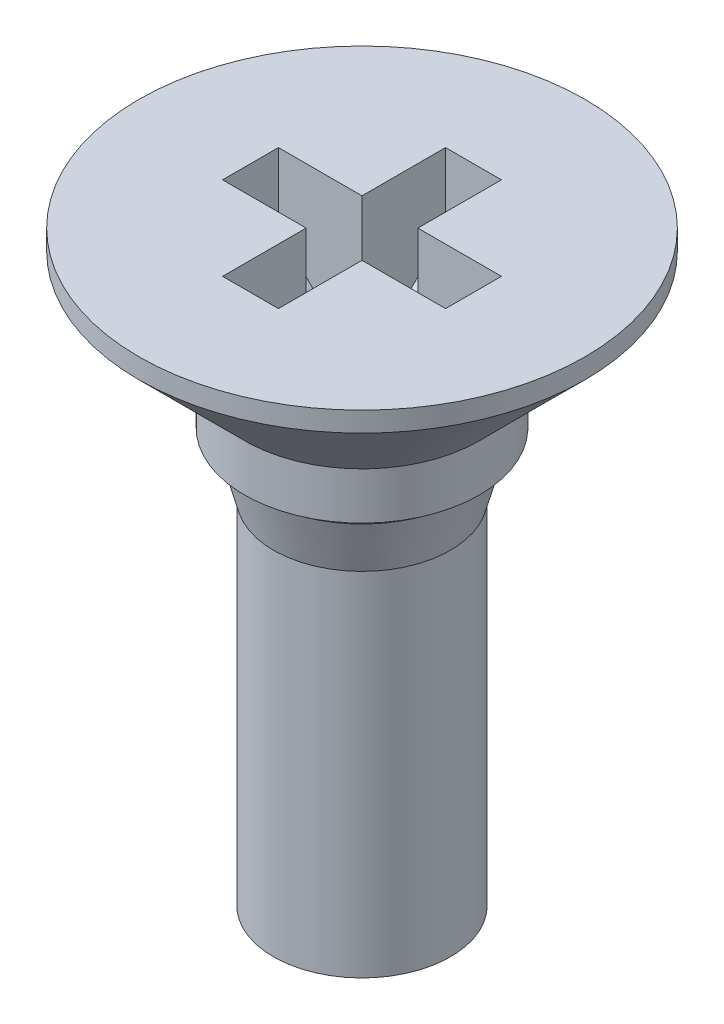
ISO-10303-21;
HEADER;
FILE_DESCRIPTION(('STEP AP214'),'2;1');
FILE_NAME('part.step','',(''),(''),'','','');
FILE_SCHEMA(('AUTOMOTIVE_DESIGN { 1 0 10303 214 1 1 1 1 }'));
ENDSEC;
DATA;
#1=APPLICATION_CONTEXT('core data for automotive mechanical design processes');
#2=APPLICATION_PROTOCOL_DEFINITION('international standard','automotive_design',2000,#1);
#3=PRODUCT_CONTEXT('',#1,'mechanical');
#4=PRODUCT('Part','Part','',(#3));
#5=PRODUCT_RELATED_PRODUCT_CATEGORY('part','',(#4));
#6=PRODUCT_DEFINITION_FORMATION('','',#4);
#7=PRODUCT_DEFINITION_CONTEXT('part definition',#1,'design');
#8=PRODUCT_DEFINITION('design','',#6,#7);
#9=PRODUCT_DEFINITION_SHAPE('','',#8);
#10=(LENGTH_UNIT() NAMED_UNIT(*) SI_UNIT(.MILLI.,.METRE.));
#11=(NAMED_UNIT(*) PLANE_ANGLE_UNIT() SI_UNIT($,.RADIAN.));
#12=(NAMED_UNIT(*) SI_UNIT($,.STERADIAN.) SOLID_ANGLE_UNIT());
#13=UNCERTAINTY_MEASURE_WITH_UNIT(LENGTH_MEASURE(1.E-05),#10,'distance_accuracy_value','');
#14=(GEOMETRIC_REPRESENTATION_CONTEXT(3) GLOBAL_UNCERTAINTY_ASSIGNED_CONTEXT((#13)) GLOBAL_UNIT_ASSIGNED_CONTEXT((#10,
#11,#12)) REPRESENTATION_CONTEXT('',''));
#15=CARTESIAN_POINT('',(0.,0.,0.));
#16=DIRECTION('',(0.,0.,1.));
#17=DIRECTION('',(1.,0.,0.));
#18=AXIS2_PLACEMENT_3D('',#15,#16,#17);
#19=CARTESIAN_POINT('',(0.,-1.55,-0.238));
#20=DIRECTION('',(0.,0.,-1.));
#21=DIRECTION('',(-1.,0.,0.));
#22=AXIS2_PLACEMENT_3D('',#19,#20,#21);
#23=PLANE('',#22);
#24=DIRECTION('',(0.,1.,0.));
#25=VECTOR('',#24,1.);
#26=CARTESIAN_POINT('',(0.238,-1.55,-0.238));
#27=LINE('',#26,#25);
#28=CARTESIAN_POINT('',(0.238,-1.2,-0.238));
#29=VERTEX_POINT('',#28);
#30=CARTESIAN_POINT('',(0.238,0.,-0.238));
#31=VERTEX_POINT('',#30);
#32=EDGE_CURVE('E199',#29,#31,#27,.T.);
#33=ORIENTED_EDGE('',*,*,#32,.F.);
#34=DIRECTION('',(1.,0.,0.));
#35=VECTOR('',#34,1.);
#36=CARTESIAN_POINT('',(-0.350000000000003,-1.2,-0.238));
#37=LINE('',#36,#35);
#38=CARTESIAN_POINT('',(0.350000000000003,-1.2,-0.238));
#39=VERTEX_POINT('',#38);
#40=EDGE_CURVE('E234',#29,#39,#37,.T.);
#41=ORIENTED_EDGE('',*,*,#40,.T.);
#42=DIRECTION('',(0.707106781186546,0.707106781186549,0.));
#43=VECTOR('',#42,1.);
#44=CARTESIAN_POINT('',(0.95,-0.6,-0.238));
#45=LINE('',#44,#43);
#46=CARTESIAN_POINT('',(0.95,-0.6,-0.238));
#47=VERTEX_POINT('',#46);
#48=EDGE_CURVE('E238',#39,#47,#45,.T.);
#49=ORIENTED_EDGE('',*,*,#48,.T.);
#50=DIRECTION('',(0.,1.,0.));
#51=VECTOR('',#50,1.);
#52=CARTESIAN_POINT('',(0.95,0.,-0.238));
#53=LINE('',#52,#51);
#54=CARTESIAN_POINT('',(0.95,0.,-0.238));
#55=VERTEX_POINT('',#54);
#56=EDGE_CURVE('E241',#47,#55,#53,.T.);
#57=ORIENTED_EDGE('',*,*,#56,.T.);
#58=DIRECTION('',(-1.,0.,0.));
#59=VECTOR('',#58,1.);
#60=CARTESIAN_POINT('',(0.95,0.,-0.238));
#61=LINE('',#60,#59);
#62=EDGE_CURVE('E245',#55,#31,#61,.T.);
#63=ORIENTED_EDGE('',*,*,#62,.T.);
#64=EDGE_LOOP('',(#33,#41,#49,#57,#63));
#65=FACE_BOUND('',#64,.T.);
#66=ADVANCED_FACE('F37',(#65),#23,.F.);
#67=CARTESIAN_POINT('',(0.,-1.55,0.238));
#68=DIRECTION('',(0.,0.,-1.));
#69=DIRECTION('',(-1.,0.,0.));
#70=AXIS2_PLACEMENT_3D('',#67,#68,#69);
#71=PLANE('',#70);
#72=DIRECTION('',(1.,0.,0.));
#73=VECTOR('',#72,1.);
#74=CARTESIAN_POINT('',(-0.350000000000003,-1.2,0.238));
#75=LINE('',#74,#73);
#76=CARTESIAN_POINT('',(0.238,-1.2,0.238));
#77=VERTEX_POINT('',#76);
#78=CARTESIAN_POINT('',(0.350000000000003,-1.2,0.238));
#79=VERTEX_POINT('',#78);
#80=EDGE_CURVE('E216',#77,#79,#75,.T.);
#81=ORIENTED_EDGE('',*,*,#80,.F.);
#82=DIRECTION('',(0.,1.,0.));
#83=VECTOR('',#82,1.);
#84=CARTESIAN_POINT('',(0.238,-1.55,0.238));
#85=LINE('',#84,#83);
#86=CARTESIAN_POINT('',(0.238,0.,0.238));
#87=VERTEX_POINT('',#86);
#88=EDGE_CURVE('E45',#77,#87,#85,.T.);
#89=ORIENTED_EDGE('',*,*,#88,.T.);
#90=DIRECTION('',(-1.,0.,0.));
#91=VECTOR('',#90,1.);
#92=CARTESIAN_POINT('',(0.95,0.,0.238));
#93=LINE('',#92,#91);
#94=CARTESIAN_POINT('',(0.95,0.,0.238));
#95=VERTEX_POINT('',#94);
#96=EDGE_CURVE('E225',#95,#87,#93,.T.);
#97=ORIENTED_EDGE('',*,*,#96,.F.);
#98=DIRECTION('',(0.,1.,0.));
#99=VECTOR('',#98,1.);
#100=CARTESIAN_POINT('',(0.95,0.,0.238));
#101=LINE('',#100,#99);
#102=CARTESIAN_POINT('',(0.95,-0.6,0.238));
#103=VERTEX_POINT('',#102);
#104=EDGE_CURVE('E222',#103,#95,#101,.T.);
#105=ORIENTED_EDGE('',*,*,#104,.F.);
#106=DIRECTION('',(0.707106781186546,0.707106781186549,0.));
#107=VECTOR('',#106,1.);
#108=CARTESIAN_POINT('',(0.95,-0.6,0.238));
#109=LINE('',#108,#107);
#110=EDGE_CURVE('E219',#79,#103,#109,.T.);
#111=ORIENTED_EDGE('',*,*,#110,.F.);
#112=EDGE_LOOP('',(#81,#89,#97,#105,#111));
#113=FACE_BOUND('',#112,.T.);
#114=ADVANCED_FACE('F291',(#113),#71,.T.);
#115=CARTESIAN_POINT('',(0.,0.,0.));
#116=DIRECTION('',(0.,-1.,0.));
#117=DIRECTION('',(1.,0.,0.));
#118=AXIS2_PLACEMENT_3D('',#115,#116,#117);
#119=PLANE('',#118);
#120=DIRECTION('',(1.,0.,0.));
#121=VECTOR('',#120,1.);
#122=CARTESIAN_POINT('',(-0.238,0.,0.95));
#123=LINE('',#122,#121);
#124=CARTESIAN_POINT('',(-0.238,0.,0.95));
#125=VERTEX_POINT('',#124);
#126=CARTESIAN_POINT('',(0.238,0.,0.95));
#127=VERTEX_POINT('',#126);
#128=EDGE_CURVE('E200',#125,#127,#123,.T.);
#129=ORIENTED_EDGE('',*,*,#128,.F.);
#130=DIRECTION('',(0.,0.,1.));
#131=VECTOR('',#130,1.);
#132=CARTESIAN_POINT('',(-0.238,0.,-0.95));
#133=LINE('',#132,#131);
#134=CARTESIAN_POINT('',(-0.238,0.,0.238));
#135=VERTEX_POINT('',#134);
#136=EDGE_CURVE('E193',#135,#125,#133,.T.);
#137=ORIENTED_EDGE('',*,*,#136,.F.);
#138=CARTESIAN_POINT('',(-0.95,0.,0.238));
#139=VERTEX_POINT('',#138);
#140=EDGE_CURVE('E224',#135,#139,#93,.T.);
#141=ORIENTED_EDGE('',*,*,#140,.T.);
#142=DIRECTION('',(0.,0.,1.));
#143=VECTOR('',#142,1.);
#144=CARTESIAN_POINT('',(-0.95,0.,-0.238));
#145=LINE('',#144,#143);
#146=CARTESIAN_POINT('',(-0.95,0.,-0.238));
#147=VERTEX_POINT('',#146);
#148=EDGE_CURVE('E255',#147,#139,#145,.T.);
#149=ORIENTED_EDGE('',*,*,#148,.F.);
#150=CARTESIAN_POINT('',(-0.238,0.,-0.238));
#151=VERTEX_POINT('',#150);
#152=EDGE_CURVE('E244',#151,#147,#61,.T.);
#153=ORIENTED_EDGE('',*,*,#152,.F.);
#154=CARTESIAN_POINT('',(-0.238,0.,-0.95));
#155=VERTEX_POINT('',#154);
#156=EDGE_CURVE('E194',#155,#151,#133,.T.);
#157=ORIENTED_EDGE('',*,*,#156,.F.);
#158=DIRECTION('',(1.,0.,0.));
#159=VECTOR('',#158,1.);
#160=CARTESIAN_POINT('',(-0.238,0.,-0.95));
#161=LINE('',#160,#159);
#162=CARTESIAN_POINT('',(0.238,0.,-0.95));
#163=VERTEX_POINT('',#162);
#164=EDGE_CURVE('E202',#155,#163,#161,.T.);
#165=ORIENTED_EDGE('',*,*,#164,.T.);
#166=DIRECTION('',(0.,0.,1.));
#167=VECTOR('',#166,1.);
#168=CARTESIAN_POINT('',(0.238,0.,-0.95));
#169=LINE('',#168,#167);
#170=EDGE_CURVE('E178',#163,#31,#169,.T.);
#171=ORIENTED_EDGE('',*,*,#170,.T.);
#172=ORIENTED_EDGE('',*,*,#62,.F.);
#173=DIRECTION('',(0.,0.,1.));
#174=VECTOR('',#173,1.);
#175=CARTESIAN_POINT('',(0.95,0.,-0.238));
#176=LINE('',#175,#174);
#177=EDGE_CURVE('E258',#55,#95,#176,.T.);
#178=ORIENTED_EDGE('',*,*,#177,.T.);
#179=ORIENTED_EDGE('',*,*,#96,.T.);
#180=EDGE_CURVE('E60',#87,#127,#169,.T.);
#181=ORIENTED_EDGE('',*,*,#180,.T.);
#182=EDGE_LOOP('',(#129,#137,#141,#149,#153,#157,#165,#171,#172,#178,#179,#181));
#183=FACE_BOUND('',#182,.T.);
#184=CARTESIAN_POINT('',(0.,0.,0.));
#185=DIRECTION('',(0.,1.,0.));
#186=DIRECTION('',(-1.,0.,0.));
#187=AXIS2_PLACEMENT_3D('',#184,#185,#186);
#188=CIRCLE('',#187,1.9);
#189=CARTESIAN_POINT('',(-1.9,0.,0.));
#190=VERTEX_POINT('',#189);
#191=EDGE_CURVE('E287',#190,#190,#188,.T.);
#192=ORIENTED_EDGE('',*,*,#191,.T.);
#193=EDGE_LOOP('',(#192));
#194=FACE_BOUND('',#193,.T.);
#195=ADVANCED_FACE('F39',(#183,#194),#119,.F.);
#196=CARTESIAN_POINT('',(0.,0.,0.));
#197=DIRECTION('',(0.,1.,0.));
#198=DIRECTION('',(-1.,0.,0.));
#199=AXIS2_PLACEMENT_3D('',#196,#197,#198);
#200=CYLINDRICAL_SURFACE('',#199,1.9);
#201=ORIENTED_EDGE('',*,*,#191,.F.);
#202=EDGE_LOOP('',(#201));
#203=FACE_BOUND('',#202,.T.);
#204=CARTESIAN_POINT('',(0.,-0.170000000000003,0.));
#205=DIRECTION('',(0.,1.,0.));
#206=DIRECTION('',(-1.,0.,0.));
#207=AXIS2_PLACEMENT_3D('',#204,#205,#206);
#208=CIRCLE('',#207,1.9);
#209=CARTESIAN_POINT('',(-1.9,-0.170000000000004,0.));
#210=VERTEX_POINT('',#209);
#211=EDGE_CURVE('E284',#210,#210,#208,.T.);
#212=ORIENTED_EDGE('',*,*,#211,.T.);
#213=EDGE_LOOP('',(#212));
#214=FACE_BOUND('',#213,.T.);
#215=ADVANCED_FACE('F400',(#203,#214),#200,.T.);
#216=CARTESIAN_POINT('',(0.,-1.07,0.));
#217=DIRECTION('',(0.,1.,0.));
#218=DIRECTION('',(-1.,0.,0.));
#219=AXIS2_PLACEMENT_3D('',#216,#217,#218);
#220=CONICAL_SURFACE('',#219,1.,0.78539816339745);
#221=ORIENTED_EDGE('',*,*,#211,.F.);
#222=EDGE_LOOP('',(#221));
#223=FACE_BOUND('',#222,.T.);
#224=CARTESIAN_POINT('',(0.,-1.07,0.));
#225=DIRECTION('',(0.,1.,0.));
#226=DIRECTION('',(-1.,0.,0.));
#227=AXIS2_PLACEMENT_3D('',#224,#225,#226);
#228=CIRCLE('',#227,1.);
#229=CARTESIAN_POINT('',(-1.,-1.07,0.));
#230=VERTEX_POINT('',#229);
#231=EDGE_CURVE('E281',#230,#230,#228,.T.);
#232=ORIENTED_EDGE('',*,*,#231,.T.);
#233=EDGE_LOOP('',(#232));
#234=FACE_BOUND('',#233,.T.);
#235=ADVANCED_FACE('F397',(#223,#234),#220,.T.);
#236=CARTESIAN_POINT('',(0.,0.,0.));
#237=DIRECTION('',(0.,1.,0.));
#238=DIRECTION('',(-1.,0.,0.));
#239=AXIS2_PLACEMENT_3D('',#236,#237,#238);
#240=CYLINDRICAL_SURFACE('',#239,1.);
#241=ORIENTED_EDGE('',*,*,#231,.F.);
#242=EDGE_LOOP('',(#241));
#243=FACE_BOUND('',#242,.T.);
#244=CARTESIAN_POINT('',(0.,-1.47,0.));
#245=DIRECTION('',(0.,1.,0.));
#246=DIRECTION('',(-1.,0.,0.));
#247=AXIS2_PLACEMENT_3D('',#244,#245,#246);
#248=CIRCLE('',#247,1.);
#249=CARTESIAN_POINT('',(-1.,-1.47,0.));
#250=VERTEX_POINT('',#249);
#251=EDGE_CURVE('E278',#250,#250,#248,.T.);
#252=ORIENTED_EDGE('',*,*,#251,.T.);
#253=EDGE_LOOP('',(#252));
#254=FACE_BOUND('',#253,.T.);
#255=ADVANCED_FACE('F393',(#243,#254),#240,.T.);
#256=CARTESIAN_POINT('',(1.,-1.47,0.));
#257=DIRECTION('',(0.,1.,0.));
#258=DIRECTION('',(-1.,0.,0.));
#259=AXIS2_PLACEMENT_3D('',#256,#257,#258);
#260=PLANE('',#259);
#261=ORIENTED_EDGE('',*,*,#251,.F.);
#262=EDGE_LOOP('',(#261));
#263=FACE_BOUND('',#262,.T.);
#264=CARTESIAN_POINT('',(0.,-1.47,0.));
#265=DIRECTION('',(0.,1.,0.));
#266=DIRECTION('',(-1.,0.,0.));
#267=AXIS2_PLACEMENT_3D('',#264,#265,#266);
#268=CIRCLE('',#267,0.87);
#269=CARTESIAN_POINT('',(-0.87,-1.47,0.));
#270=VERTEX_POINT('',#269);
#271=EDGE_CURVE('E275',#270,#270,#268,.T.);
#272=ORIENTED_EDGE('',*,*,#271,.T.);
#273=EDGE_LOOP('',(#272));
#274=FACE_BOUND('',#273,.T.);
#275=ADVANCED_FACE('F389',(#263,#274),#260,.F.);
#276=CARTESIAN_POINT('',(0.,0.,0.));
#277=DIRECTION('',(0.,1.,0.));
#278=DIRECTION('',(-1.,0.,0.));
#279=AXIS2_PLACEMENT_3D('',#276,#277,#278);
#280=CYLINDRICAL_SURFACE('',#279,0.87);
#281=ORIENTED_EDGE('',*,*,#271,.F.);
#282=EDGE_LOOP('',(#281));
#283=FACE_BOUND('',#282,.T.);
#284=CARTESIAN_POINT('',(0.,-1.56894813172579,0.));
#285=DIRECTION('',(0.,1.,0.));
#286=DIRECTION('',(-1.,0.,0.));
#287=AXIS2_PLACEMENT_3D('',#284,#285,#286);
#288=CIRCLE('',#287,0.87);
#289=CARTESIAN_POINT('',(-0.87,-1.56894813172579,0.));
#290=VERTEX_POINT('',#289);
#291=EDGE_CURVE('E272',#290,#290,#288,.T.);
#292=ORIENTED_EDGE('',*,*,#291,.T.);
#293=EDGE_LOOP('',(#292));
#294=FACE_BOUND('',#293,.T.);
#295=ADVANCED_FACE('F385',(#283,#294),#280,.T.);
#296=CARTESIAN_POINT('',(0.,-2.,0.));
#297=DIRECTION('',(0.,1.,0.));
#298=DIRECTION('',(-1.,0.,0.));
#299=AXIS2_PLACEMENT_3D('',#296,#297,#298);
#300=CONICAL_SURFACE('',#299,0.7545,0.26179938779915);
#301=ORIENTED_EDGE('',*,*,#291,.F.);
#302=EDGE_LOOP('',(#301));
#303=FACE_BOUND('',#302,.T.);
#304=CARTESIAN_POINT('',(0.,-2.,0.));
#305=DIRECTION('',(0.,1.,0.));
#306=DIRECTION('',(-1.,0.,0.));
#307=AXIS2_PLACEMENT_3D('',#304,#305,#306);
#308=CIRCLE('',#307,0.7545);
#309=CARTESIAN_POINT('',(-0.7545,-2.,0.));
#310=VERTEX_POINT('',#309);
#311=EDGE_CURVE('E269',#310,#310,#308,.T.);
#312=ORIENTED_EDGE('',*,*,#311,.T.);
#313=EDGE_LOOP('',(#312));
#314=FACE_BOUND('',#313,.T.);
#315=ADVANCED_FACE('F381',(#303,#314),#300,.T.);
#316=CARTESIAN_POINT('',(0.,0.,0.));
#317=DIRECTION('',(0.,1.,0.));
#318=DIRECTION('',(-1.,0.,0.));
#319=AXIS2_PLACEMENT_3D('',#316,#317,#318);
#320=CYLINDRICAL_SURFACE('',#319,0.7545);
#321=ORIENTED_EDGE('',*,*,#311,.F.);
#322=EDGE_LOOP('',(#321));
#323=FACE_BOUND('',#322,.T.);
#324=CARTESIAN_POINT('',(0.,-5.,0.));
#325=DIRECTION('',(0.,1.,0.));
#326=DIRECTION('',(-1.,0.,0.));
#327=AXIS2_PLACEMENT_3D('',#324,#325,#326);
#328=CIRCLE('',#327,0.7545);
#329=CARTESIAN_POINT('',(-0.754499999999999,-5.,0.));
#330=VERTEX_POINT('',#329);
#331=EDGE_CURVE('E254',#330,#330,#328,.T.);
#332=ORIENTED_EDGE('',*,*,#331,.T.);
#333=EDGE_LOOP('',(#332));
#334=FACE_BOUND('',#333,.T.);
#335=ADVANCED_FACE('F377',(#323,#334),#320,.T.);
#336=CARTESIAN_POINT('',(0.754500000000001,-5.,0.));
#337=DIRECTION('',(0.,1.,0.));
#338=DIRECTION('',(-1.,0.,0.));
#339=AXIS2_PLACEMENT_3D('',#336,#337,#338);
#340=PLANE('',#339);
#341=ORIENTED_EDGE('',*,*,#331,.F.);
#342=EDGE_LOOP('',(#341));
#343=FACE_BOUND('',#342,.T.);
#344=ADVANCED_FACE('F374',(#343),#340,.F.);
#345=CARTESIAN_POINT('',(-0.95,-0.6,-0.238));
#346=DIRECTION('',(-0.707106781186549,-0.707106781186546,0.));
#347=DIRECTION('',(0.707106781186546,-0.707106781186549,0.));
#348=AXIS2_PLACEMENT_3D('',#345,#346,#347);
#349=PLANE('',#348);
#350=DIRECTION('',(0.,0.,1.));
#351=VECTOR('',#350,1.);
#352=CARTESIAN_POINT('',(-0.350000000000003,-1.2,-0.238));
#353=LINE('',#352,#351);
#354=CARTESIAN_POINT('',(-0.350000000000003,-1.2,-0.238));
#355=VERTEX_POINT('',#354);
#356=CARTESIAN_POINT('',(-0.350000000000003,-1.2,0.238));
#357=VERTEX_POINT('',#356);
#358=EDGE_CURVE('E251',#355,#357,#353,.T.);
#359=ORIENTED_EDGE('',*,*,#358,.F.);
#360=DIRECTION('',(0.707106781186546,-0.707106781186549,0.));
#361=VECTOR('',#360,1.);
#362=CARTESIAN_POINT('',(-0.95,-0.6,-0.238));
#363=LINE('',#362,#361);
#364=CARTESIAN_POINT('',(-0.95,-0.6,-0.238));
#365=VERTEX_POINT('',#364);
#366=EDGE_CURVE('E231',#365,#355,#363,.T.);
#367=ORIENTED_EDGE('',*,*,#366,.F.);
#368=DIRECTION('',(0.,0.,1.));
#369=VECTOR('',#368,1.);
#370=CARTESIAN_POINT('',(-0.95,-0.6,-0.238));
#371=LINE('',#370,#369);
#372=CARTESIAN_POINT('',(-0.95,-0.6,0.238));
#373=VERTEX_POINT('',#372);
#374=EDGE_CURVE('E252',#365,#373,#371,.T.);
#375=ORIENTED_EDGE('',*,*,#374,.T.);
#376=DIRECTION('',(0.707106781186546,-0.707106781186549,0.));
#377=VECTOR('',#376,1.);
#378=CARTESIAN_POINT('',(-0.95,-0.6,0.238));
#379=LINE('',#378,#377);
#380=EDGE_CURVE('E213',#373,#357,#379,.T.);
#381=ORIENTED_EDGE('',*,*,#380,.T.);
#382=EDGE_LOOP('',(#359,#367,#375,#381));
#383=FACE_BOUND('',#382,.T.);
#384=ADVANCED_FACE('F328',(#383),#349,.F.);
#385=CARTESIAN_POINT('',(-0.95,0.,-0.238));
#386=DIRECTION('',(-1.,0.,0.));
#387=DIRECTION('',(0.,0.,1.));
#388=AXIS2_PLACEMENT_3D('',#385,#386,#387);
#389=PLANE('',#388);
#390=ORIENTED_EDGE('',*,*,#374,.F.);
#391=DIRECTION('',(0.,-1.,0.));
#392=VECTOR('',#391,1.);
#393=CARTESIAN_POINT('',(-0.95,0.,-0.238));
#394=LINE('',#393,#392);
#395=EDGE_CURVE('E248',#147,#365,#394,.T.);
#396=ORIENTED_EDGE('',*,*,#395,.F.);
#397=ORIENTED_EDGE('',*,*,#148,.T.);
#398=DIRECTION('',(0.,-1.,0.));
#399=VECTOR('',#398,1.);
#400=CARTESIAN_POINT('',(-0.95,0.,0.238));
#401=LINE('',#400,#399);
#402=EDGE_CURVE('E228',#139,#373,#401,.T.);
#403=ORIENTED_EDGE('',*,*,#402,.T.);
#404=EDGE_LOOP('',(#390,#396,#397,#403));
#405=FACE_BOUND('',#404,.T.);
#406=ADVANCED_FACE('F373',(#405),#389,.F.);
#407=CARTESIAN_POINT('',(0.95,0.,-0.238));
#408=DIRECTION('',(1.,0.,0.));
#409=DIRECTION('',(0.,0.,-1.));
#410=AXIS2_PLACEMENT_3D('',#407,#408,#409);
#411=PLANE('',#410);
#412=ORIENTED_EDGE('',*,*,#177,.F.);
#413=ORIENTED_EDGE('',*,*,#56,.F.);
#414=DIRECTION('',(0.,0.,1.));
#415=VECTOR('',#414,1.);
#416=CARTESIAN_POINT('',(0.95,-0.6,-0.238));
#417=LINE('',#416,#415);
#418=EDGE_CURVE('E261',#47,#103,#417,.T.);
#419=ORIENTED_EDGE('',*,*,#418,.T.);
#420=ORIENTED_EDGE('',*,*,#104,.T.);
#421=EDGE_LOOP('',(#412,#413,#419,#420));
#422=FACE_BOUND('',#421,.T.);
#423=ADVANCED_FACE('F300',(#422),#411,.F.);
#424=CARTESIAN_POINT('',(0.95,-0.6,-0.238));
#425=DIRECTION('',(0.707106781186549,-0.707106781186546,0.));
#426=DIRECTION('',(0.707106781186546,0.707106781186549,0.));
#427=AXIS2_PLACEMENT_3D('',#424,#425,#426);
#428=PLANE('',#427);
#429=ORIENTED_EDGE('',*,*,#418,.F.);
#430=ORIENTED_EDGE('',*,*,#48,.F.);
#431=DIRECTION('',(0.,0.,1.));
#432=VECTOR('',#431,1.);
#433=CARTESIAN_POINT('',(0.350000000000003,-1.2,-0.238));
#434=LINE('',#433,#432);
#435=EDGE_CURVE('E263',#39,#79,#434,.T.);
#436=ORIENTED_EDGE('',*,*,#435,.T.);
#437=ORIENTED_EDGE('',*,*,#110,.T.);
#438=EDGE_LOOP('',(#429,#430,#436,#437));
#439=FACE_BOUND('',#438,.T.);
#440=ADVANCED_FACE('F306',(#439),#428,.F.);
#441=CARTESIAN_POINT('',(-0.350000000000003,-1.2,-0.238));
#442=DIRECTION('',(0.,-1.,0.));
#443=DIRECTION('',(0.,0.,-1.));
#444=AXIS2_PLACEMENT_3D('',#441,#442,#443);
#445=PLANE('',#444);
#446=CARTESIAN_POINT('',(-0.238,-1.2,0.238));
#447=VERTEX_POINT('',#446);
#448=EDGE_CURVE('E217',#357,#447,#75,.T.);
#449=ORIENTED_EDGE('',*,*,#448,.T.);
#450=DIRECTION('',(0.,0.,-1.));
#451=VECTOR('',#450,1.);
#452=CARTESIAN_POINT('',(-0.238,-1.2,0.350000000000003));
#453=LINE('',#452,#451);
#454=CARTESIAN_POINT('',(-0.238,-1.2,0.350000000000003));
#455=VERTEX_POINT('',#454);
#456=EDGE_CURVE('E156',#455,#447,#453,.T.);
#457=ORIENTED_EDGE('',*,*,#456,.F.);
#458=DIRECTION('',(1.,0.,0.));
#459=VECTOR('',#458,1.);
#460=CARTESIAN_POINT('',(-0.238,-1.2,0.350000000000003));
#461=LINE('',#460,#459);
#462=CARTESIAN_POINT('',(0.238,-1.2,0.350000000000003));
#463=VERTEX_POINT('',#462);
#464=EDGE_CURVE('E150',#455,#463,#461,.T.);
#465=ORIENTED_EDGE('',*,*,#464,.T.);
#466=DIRECTION('',(0.,0.,-1.));
#467=VECTOR('',#466,1.);
#468=CARTESIAN_POINT('',(0.238,-1.2,0.350000000000003));
#469=LINE('',#468,#467);
#470=EDGE_CURVE('E154',#463,#77,#469,.T.);
#471=ORIENTED_EDGE('',*,*,#470,.T.);
#472=ORIENTED_EDGE('',*,*,#80,.T.);
#473=ORIENTED_EDGE('',*,*,#435,.F.);
#474=ORIENTED_EDGE('',*,*,#40,.F.);
#475=CARTESIAN_POINT('',(0.238,-1.2,-0.350000000000003));
#476=VERTEX_POINT('',#475);
#477=EDGE_CURVE('E52',#29,#476,#469,.T.);
#478=ORIENTED_EDGE('',*,*,#477,.T.);
#479=DIRECTION('',(1.,0.,0.));
#480=VECTOR('',#479,1.);
#481=CARTESIAN_POINT('',(-0.238,-1.2,-0.350000000000003));
#482=LINE('',#481,#480);
#483=CARTESIAN_POINT('',(-0.238,-1.2,-0.350000000000003));
#484=VERTEX_POINT('',#483);
#485=EDGE_CURVE('E161',#484,#476,#482,.T.);
#486=ORIENTED_EDGE('',*,*,#485,.F.);
#487=CARTESIAN_POINT('',(-0.238,-1.2,-0.238));
#488=VERTEX_POINT('',#487);
#489=EDGE_CURVE('E185',#488,#484,#453,.T.);
#490=ORIENTED_EDGE('',*,*,#489,.F.);
#491=EDGE_CURVE('E235',#355,#488,#37,.T.);
#492=ORIENTED_EDGE('',*,*,#491,.F.);
#493=ORIENTED_EDGE('',*,*,#358,.T.);
#494=EDGE_LOOP('',(#449,#457,#465,#471,#472,#473,#474,#478,#486,#490,#492,#493));
#495=FACE_BOUND('',#494,.T.);
#496=ADVANCED_FACE('F153',(#495),#445,.F.);
#497=ORIENTED_EDGE('',*,*,#491,.T.);
#498=DIRECTION('',(0.,1.,0.));
#499=VECTOR('',#498,1.);
#500=CARTESIAN_POINT('',(-0.238,-1.55,-0.238));
#501=LINE('',#500,#499);
#502=EDGE_CURVE('E210',#488,#151,#501,.T.);
#503=ORIENTED_EDGE('',*,*,#502,.T.);
#504=ORIENTED_EDGE('',*,*,#152,.T.);
#505=ORIENTED_EDGE('',*,*,#395,.T.);
#506=ORIENTED_EDGE('',*,*,#366,.T.);
#507=EDGE_LOOP('',(#497,#503,#504,#505,#506));
#508=FACE_BOUND('',#507,.T.);
#509=ADVANCED_FACE('F323',(#508),#23,.F.);
#510=DIRECTION('',(0.,1.,0.));
#511=VECTOR('',#510,1.);
#512=CARTESIAN_POINT('',(-0.238,-1.55,0.238));
#513=LINE('',#512,#511);
#514=EDGE_CURVE('E11',#447,#135,#513,.T.);
#515=ORIENTED_EDGE('',*,*,#514,.F.);
#516=ORIENTED_EDGE('',*,*,#448,.F.);
#517=ORIENTED_EDGE('',*,*,#380,.F.);
#518=ORIENTED_EDGE('',*,*,#402,.F.);
#519=ORIENTED_EDGE('',*,*,#140,.F.);
#520=EDGE_LOOP('',(#515,#516,#517,#518,#519));
#521=FACE_BOUND('',#520,.T.);
#522=ADVANCED_FACE('F333',(#521),#71,.T.);
#523=CARTESIAN_POINT('',(-0.238,-0.6,0.95));
#524=DIRECTION('',(0.,-0.707106781186546,0.707106781186549));
#525=DIRECTION('',(0.,-0.707106781186549,-0.707106781186546));
#526=AXIS2_PLACEMENT_3D('',#523,#524,#525);
#527=PLANE('',#526);
#528=ORIENTED_EDGE('',*,*,#464,.F.);
#529=DIRECTION('',(0.,-0.707106781186549,-0.707106781186546));
#530=VECTOR('',#529,1.);
#531=CARTESIAN_POINT('',(-0.238,-0.6,0.95));
#532=LINE('',#531,#530);
#533=CARTESIAN_POINT('',(-0.238,-0.6,0.95));
#534=VERTEX_POINT('',#533);
#535=EDGE_CURVE('E183',#534,#455,#532,.T.);
#536=ORIENTED_EDGE('',*,*,#535,.F.);
#537=DIRECTION('',(1.,0.,0.));
#538=VECTOR('',#537,1.);
#539=CARTESIAN_POINT('',(-0.238,-0.6,0.95));
#540=LINE('',#539,#538);
#541=CARTESIAN_POINT('',(0.238,-0.6,0.95));
#542=VERTEX_POINT('',#541);
#543=EDGE_CURVE('E170',#534,#542,#540,.T.);
#544=ORIENTED_EDGE('',*,*,#543,.T.);
#545=DIRECTION('',(0.,-0.707106781186549,-0.707106781186546));
#546=VECTOR('',#545,1.);
#547=CARTESIAN_POINT('',(0.238,-0.6,0.95));
#548=LINE('',#547,#546);
#549=EDGE_CURVE('E166',#542,#463,#548,.T.);
#550=ORIENTED_EDGE('',*,*,#549,.T.);
#551=EDGE_LOOP('',(#528,#536,#544,#550));
#552=FACE_BOUND('',#551,.T.);
#553=ADVANCED_FACE('F169',(#552),#527,.F.);
#554=CARTESIAN_POINT('',(-0.238,-1.55,0.));
#555=DIRECTION('',(-1.,0.,0.));
#556=DIRECTION('',(0.,0.,1.));
#557=AXIS2_PLACEMENT_3D('',#554,#555,#556);
#558=PLANE('',#557);
#559=ORIENTED_EDGE('',*,*,#514,.T.);
#560=ORIENTED_EDGE('',*,*,#136,.T.);
#561=DIRECTION('',(0.,-1.,0.));
#562=VECTOR('',#561,1.);
#563=CARTESIAN_POINT('',(-0.238,0.,0.95));
#564=LINE('',#563,#562);
#565=EDGE_CURVE('E162',#125,#534,#564,.T.);
#566=ORIENTED_EDGE('',*,*,#565,.T.);
#567=ORIENTED_EDGE('',*,*,#535,.T.);
#568=ORIENTED_EDGE('',*,*,#456,.T.);
#569=EDGE_LOOP('',(#559,#560,#566,#567,#568));
#570=FACE_BOUND('',#569,.T.);
#571=ADVANCED_FACE('F338',(#570),#558,.F.);
#572=CARTESIAN_POINT('',(0.238,-1.55,0.));
#573=DIRECTION('',(-1.,0.,0.));
#574=DIRECTION('',(0.,0.,1.));
#575=AXIS2_PLACEMENT_3D('',#572,#573,#574);
#576=PLANE('',#575);
#577=ORIENTED_EDGE('',*,*,#470,.F.);
#578=ORIENTED_EDGE('',*,*,#549,.F.);
#579=DIRECTION('',(0.,-1.,0.));
#580=VECTOR('',#579,1.);
#581=CARTESIAN_POINT('',(0.238,0.,0.95));
#582=LINE('',#581,#580);
#583=EDGE_CURVE('E181',#127,#542,#582,.T.);
#584=ORIENTED_EDGE('',*,*,#583,.F.);
#585=ORIENTED_EDGE('',*,*,#180,.F.);
#586=ORIENTED_EDGE('',*,*,#88,.F.);
#587=EDGE_LOOP('',(#577,#578,#584,#585,#586));
#588=FACE_BOUND('',#587,.T.);
#589=ADVANCED_FACE('F165',(#588),#576,.T.);
#590=CARTESIAN_POINT('',(-0.238,0.,0.95));
#591=DIRECTION('',(0.,0.,1.));
#592=DIRECTION('',(1.,0.,0.));
#593=AXIS2_PLACEMENT_3D('',#590,#591,#592);
#594=PLANE('',#593);
#595=ORIENTED_EDGE('',*,*,#543,.F.);
#596=ORIENTED_EDGE('',*,*,#565,.F.);
#597=ORIENTED_EDGE('',*,*,#128,.T.);
#598=ORIENTED_EDGE('',*,*,#583,.T.);
#599=EDGE_LOOP('',(#595,#596,#597,#598));
#600=FACE_BOUND('',#599,.T.);
#601=ADVANCED_FACE('F342',(#600),#594,.F.);
#602=ORIENTED_EDGE('',*,*,#489,.T.);
#603=DIRECTION('',(0.,0.707106781186549,-0.707106781186546));
#604=VECTOR('',#603,1.);
#605=CARTESIAN_POINT('',(-0.238,-0.6,-0.95));
#606=LINE('',#605,#604);
#607=CARTESIAN_POINT('',(-0.238,-0.6,-0.95));
#608=VERTEX_POINT('',#607);
#609=EDGE_CURVE('E187',#484,#608,#606,.T.);
#610=ORIENTED_EDGE('',*,*,#609,.T.);
#611=DIRECTION('',(0.,1.,0.));
#612=VECTOR('',#611,1.);
#613=CARTESIAN_POINT('',(-0.238,0.,-0.95));
#614=LINE('',#613,#612);
#615=EDGE_CURVE('E190',#608,#155,#614,.T.);
#616=ORIENTED_EDGE('',*,*,#615,.T.);
#617=ORIENTED_EDGE('',*,*,#156,.T.);
#618=ORIENTED_EDGE('',*,*,#502,.F.);
#619=EDGE_LOOP('',(#602,#610,#616,#617,#618));
#620=FACE_BOUND('',#619,.T.);
#621=ADVANCED_FACE('F320',(#620),#558,.F.);
#622=ORIENTED_EDGE('',*,*,#32,.T.);
#623=ORIENTED_EDGE('',*,*,#170,.F.);
#624=DIRECTION('',(0.,1.,0.));
#625=VECTOR('',#624,1.);
#626=CARTESIAN_POINT('',(0.238,0.,-0.95));
#627=LINE('',#626,#625);
#628=CARTESIAN_POINT('',(0.238,-0.6,-0.95));
#629=VERTEX_POINT('',#628);
#630=EDGE_CURVE('E176',#629,#163,#627,.T.);
#631=ORIENTED_EDGE('',*,*,#630,.F.);
#632=DIRECTION('',(0.,0.707106781186549,-0.707106781186546));
#633=VECTOR('',#632,1.);
#634=CARTESIAN_POINT('',(0.238,-0.6,-0.95));
#635=LINE('',#634,#633);
#636=EDGE_CURVE('E167',#476,#629,#635,.T.);
#637=ORIENTED_EDGE('',*,*,#636,.F.);
#638=ORIENTED_EDGE('',*,*,#477,.F.);
#639=EDGE_LOOP('',(#622,#623,#631,#637,#638));
#640=FACE_BOUND('',#639,.T.);
#641=ADVANCED_FACE('F313',(#640),#576,.T.);
#642=CARTESIAN_POINT('',(-0.238,0.,-0.95));
#643=DIRECTION('',(0.,0.,-1.));
#644=DIRECTION('',(-1.,0.,0.));
#645=AXIS2_PLACEMENT_3D('',#642,#643,#644);
#646=PLANE('',#645);
#647=ORIENTED_EDGE('',*,*,#164,.F.);
#648=ORIENTED_EDGE('',*,*,#615,.F.);
#649=DIRECTION('',(1.,0.,0.));
#650=VECTOR('',#649,1.);
#651=CARTESIAN_POINT('',(-0.238,-0.6,-0.95));
#652=LINE('',#651,#650);
#653=EDGE_CURVE('E205',#608,#629,#652,.T.);
#654=ORIENTED_EDGE('',*,*,#653,.T.);
#655=ORIENTED_EDGE('',*,*,#630,.T.);
#656=EDGE_LOOP('',(#647,#648,#654,#655));
#657=FACE_BOUND('',#656,.T.);
#658=ADVANCED_FACE('F316',(#657),#646,.F.);
#659=CARTESIAN_POINT('',(-0.238,-0.6,-0.95));
#660=DIRECTION('',(0.,-0.707106781186546,-0.707106781186549));
#661=DIRECTION('',(0.,0.707106781186549,-0.707106781186546));
#662=AXIS2_PLACEMENT_3D('',#659,#660,#661);
#663=PLANE('',#662);
#664=ORIENTED_EDGE('',*,*,#653,.F.);
#665=ORIENTED_EDGE('',*,*,#609,.F.);
#666=ORIENTED_EDGE('',*,*,#485,.T.);
#667=ORIENTED_EDGE('',*,*,#636,.T.);
#668=EDGE_LOOP('',(#664,#665,#666,#667));
#669=FACE_BOUND('',#668,.T.);
#670=ADVANCED_FACE('F311',(#669),#663,.F.);
#671=CLOSED_SHELL('',(#66,#114,#195,#215,#235,#255,#275,#295,#315,#335,#344,#384,#406,#423,#440,
#496,#509,#522,#553,#571,#589,#601,#621,#641,#658,#670));
#672=MANIFOLD_SOLID_BREP('B2',#671);
#673=ADVANCED_BREP_SHAPE_REPRESENTATION('',(#18,#672),#14);
#674=SHAPE_DEFINITION_REPRESENTATION(#9,#673);
ENDSEC;
END-ISO-10303-21;
